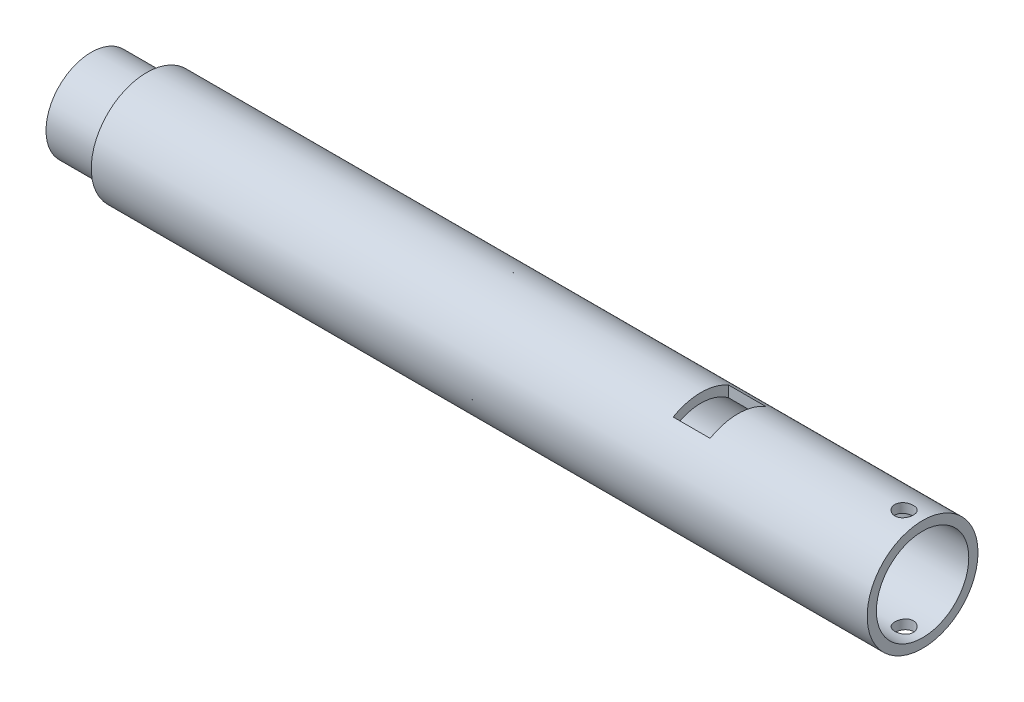
ISO-10303-21;
HEADER;
FILE_DESCRIPTION(('STEP AP214'),'2;1');
FILE_NAME('part.step','',(''),(''),'','','');
FILE_SCHEMA(('AUTOMOTIVE_DESIGN { 1 0 10303 214 1 1 1 1 }'));
ENDSEC;
DATA;
#1=APPLICATION_CONTEXT('core data for automotive mechanical design processes');
#2=APPLICATION_PROTOCOL_DEFINITION('international standard','automotive_design',2000,#1);
#3=PRODUCT_CONTEXT('',#1,'mechanical');
#4=PRODUCT('Part','Part','',(#3));
#5=PRODUCT_RELATED_PRODUCT_CATEGORY('part','',(#4));
#6=PRODUCT_DEFINITION_FORMATION('','',#4);
#7=PRODUCT_DEFINITION_CONTEXT('part definition',#1,'design');
#8=PRODUCT_DEFINITION('design','',#6,#7);
#9=PRODUCT_DEFINITION_SHAPE('','',#8);
#10=(LENGTH_UNIT() NAMED_UNIT(*) SI_UNIT(.MILLI.,.METRE.));
#11=(NAMED_UNIT(*) PLANE_ANGLE_UNIT() SI_UNIT($,.RADIAN.));
#12=(NAMED_UNIT(*) SI_UNIT($,.STERADIAN.) SOLID_ANGLE_UNIT());
#13=UNCERTAINTY_MEASURE_WITH_UNIT(LENGTH_MEASURE(1.E-05),#10,'distance_accuracy_value','');
#14=(GEOMETRIC_REPRESENTATION_CONTEXT(3) GLOBAL_UNCERTAINTY_ASSIGNED_CONTEXT((#13)) GLOBAL_UNIT_ASSIGNED_CONTEXT((#10,
#11,#12)) REPRESENTATION_CONTEXT('',''));
#15=CARTESIAN_POINT('',(0.,0.,0.));
#16=DIRECTION('',(0.,0.,1.));
#17=DIRECTION('',(1.,0.,0.));
#18=AXIS2_PLACEMENT_3D('',#15,#16,#17);
#19=CARTESIAN_POINT('',(0.,0.,0.));
#20=DIRECTION('',(-1.,0.,0.));
#21=DIRECTION('',(0.,0.,1.));
#22=AXIS2_PLACEMENT_3D('',#19,#20,#21);
#23=CYLINDRICAL_SURFACE('',#22,12.25);
#24=CARTESIAN_POINT('',(0.,0.,0.));
#25=DIRECTION('',(-1.,0.,0.));
#26=DIRECTION('',(0.,0.,1.));
#27=AXIS2_PLACEMENT_3D('',#24,#25,#26);
#28=CIRCLE('',#27,12.25);
#29=CARTESIAN_POINT('',(0.,0.,12.25));
#30=VERTEX_POINT('',#29);
#31=EDGE_CURVE('E185',#30,#30,#28,.T.);
#32=ORIENTED_EDGE('',*,*,#31,.T.);
#33=EDGE_LOOP('',(#32));
#34=FACE_BOUND('',#33,.T.);
#35=CARTESIAN_POINT('',(-15.,0.,0.));
#36=DIRECTION('',(-1.,0.,0.));
#37=DIRECTION('',(0.,0.,1.));
#38=AXIS2_PLACEMENT_3D('',#35,#36,#37);
#39=CIRCLE('',#38,12.25);
#40=CARTESIAN_POINT('',(-15.,0.,12.25));
#41=VERTEX_POINT('',#40);
#42=EDGE_CURVE('E12',#41,#41,#39,.T.);
#43=ORIENTED_EDGE('',*,*,#42,.F.);
#44=EDGE_LOOP('',(#43));
#45=FACE_BOUND('',#44,.T.);
#46=ADVANCED_FACE('F51',(#34,#45),#23,.T.);
#47=CARTESIAN_POINT('',(-15.,0.,0.));
#48=DIRECTION('',(-1.,0.,0.));
#49=DIRECTION('',(0.,0.,1.));
#50=AXIS2_PLACEMENT_3D('',#47,#48,#49);
#51=PLANE('',#50);
#52=CARTESIAN_POINT('',(-15.,0.,0.));
#53=DIRECTION('',(-1.,0.,0.));
#54=DIRECTION('',(0.,0.,1.));
#55=AXIS2_PLACEMENT_3D('',#52,#53,#54);
#56=CIRCLE('',#55,10.);
#57=CARTESIAN_POINT('',(-15.,0.,10.));
#58=VERTEX_POINT('',#57);
#59=EDGE_CURVE('E58',#58,#58,#56,.T.);
#60=ORIENTED_EDGE('',*,*,#59,.F.);
#61=EDGE_LOOP('',(#60));
#62=FACE_BOUND('',#61,.T.);
#63=ORIENTED_EDGE('',*,*,#42,.T.);
#64=EDGE_LOOP('',(#63));
#65=FACE_BOUND('',#64,.T.);
#66=ADVANCED_FACE('F229',(#62,#65),#51,.T.);
#67=CARTESIAN_POINT('',(0.,0.,0.));
#68=DIRECTION('',(-1.,0.,0.));
#69=DIRECTION('',(0.,0.,1.));
#70=AXIS2_PLACEMENT_3D('',#67,#68,#69);
#71=CYLINDRICAL_SURFACE('',#70,10.);
#72=ORIENTED_EDGE('',*,*,#59,.T.);
#73=EDGE_LOOP('',(#72));
#74=FACE_BOUND('',#73,.T.);
#75=CARTESIAN_POINT('',(10.,0.,0.));
#76=DIRECTION('',(-1.,0.,0.));
#77=DIRECTION('',(0.,0.,1.));
#78=AXIS2_PLACEMENT_3D('',#75,#76,#77);
#79=CIRCLE('',#78,10.);
#80=CARTESIAN_POINT('',(10.,0.,10.));
#81=VERTEX_POINT('',#80);
#82=EDGE_CURVE('E53',#81,#81,#79,.T.);
#83=ORIENTED_EDGE('',*,*,#82,.F.);
#84=EDGE_LOOP('',(#83));
#85=FACE_BOUND('',#84,.T.);
#86=ADVANCED_FACE('F195',(#74,#85),#71,.F.);
#87=CARTESIAN_POINT('',(0.,0.,0.));
#88=DIRECTION('',(-1.,0.,0.));
#89=DIRECTION('',(0.,0.,1.));
#90=AXIS2_PLACEMENT_3D('',#87,#88,#89);
#91=PLANE('',#90);
#92=ORIENTED_EDGE('',*,*,#31,.F.);
#93=EDGE_LOOP('',(#92));
#94=FACE_BOUND('',#93,.T.);
#95=CARTESIAN_POINT('',(0.,0.,0.));
#96=DIRECTION('',(1.,0.,0.));
#97=DIRECTION('',(0.,0.,-1.));
#98=AXIS2_PLACEMENT_3D('',#95,#96,#97);
#99=CIRCLE('',#98,15.);
#100=CARTESIAN_POINT('',(0.,0.,-15.));
#101=VERTEX_POINT('',#100);
#102=EDGE_CURVE('E200',#101,#101,#99,.T.);
#103=ORIENTED_EDGE('',*,*,#102,.F.);
#104=EDGE_LOOP('',(#103));
#105=FACE_BOUND('',#104,.T.);
#106=ADVANCED_FACE('F192',(#94,#105),#91,.T.);
#107=CARTESIAN_POINT('',(210.,0.,0.));
#108=DIRECTION('',(-1.,0.,0.));
#109=DIRECTION('',(0.,0.,1.));
#110=AXIS2_PLACEMENT_3D('',#107,#108,#109);
#111=CYLINDRICAL_SURFACE('',#110,12.5);
#112=DIRECTION('',(-1.,0.,0.));
#113=VECTOR('',#112,1.);
#114=CARTESIAN_POINT('',(210.,10.,7.5));
#115=LINE('',#114,#113);
#116=CARTESIAN_POINT('',(150.,10.,7.5));
#117=VERTEX_POINT('',#116);
#118=CARTESIAN_POINT('',(160.,10.,7.5));
#119=VERTEX_POINT('',#118);
#120=EDGE_CURVE('E163',#117,#119,#115,.F.);
#121=ORIENTED_EDGE('',*,*,#120,.T.);
#122=CARTESIAN_POINT('',(160.,0.,0.));
#123=DIRECTION('',(-1.,0.,0.));
#124=DIRECTION('',(0.,0.,1.));
#125=AXIS2_PLACEMENT_3D('',#122,#123,#124);
#126=CIRCLE('',#125,12.5);
#127=CARTESIAN_POINT('',(160.,10.,-7.5));
#128=VERTEX_POINT('',#127);
#129=EDGE_CURVE('E104',#119,#128,#126,.T.);
#130=ORIENTED_EDGE('',*,*,#129,.T.);
#131=DIRECTION('',(-1.,0.,0.));
#132=VECTOR('',#131,1.);
#133=CARTESIAN_POINT('',(210.,10.,-7.5));
#134=LINE('',#133,#132);
#135=CARTESIAN_POINT('',(150.,10.,-7.5));
#136=VERTEX_POINT('',#135);
#137=EDGE_CURVE('E175',#128,#136,#134,.T.);
#138=ORIENTED_EDGE('',*,*,#137,.T.);
#139=CARTESIAN_POINT('',(150.,0.,0.));
#140=DIRECTION('',(1.,0.,0.));
#141=DIRECTION('',(0.,0.,-1.));
#142=AXIS2_PLACEMENT_3D('',#139,#140,#141);
#143=CIRCLE('',#142,12.5);
#144=EDGE_CURVE('E170',#136,#117,#143,.T.);
#145=ORIENTED_EDGE('',*,*,#144,.T.);
#146=EDGE_LOOP('',(#121,#130,#138,#145));
#147=FACE_BOUND('',#146,.T.);
#148=CARTESIAN_POINT('',(205.,12.2474487139159,-2.5));
#149=CARTESIAN_POINT('',(204.861089061272,12.2474514756662,-2.49999486468817));
#150=CARTESIAN_POINT('',(204.722113441667,12.2498377067175,-2.48838292929536));
#151=CARTESIAN_POINT('',(204.448093737142,12.2591107826219,-2.4422807089571));
#152=CARTESIAN_POINT('',(204.31305288841,12.2660012286197,-2.40777211767623));
#153=CARTESIAN_POINT('',(204.050906741614,12.2834718430464,-2.31698945654936));
#154=CARTESIAN_POINT('',(203.923793696169,12.2940483405269,-2.26073703538156));
#155=CARTESIAN_POINT('',(203.680812888258,12.3176949870165,-2.12812276917627));
#156=CARTESIAN_POINT('',(203.564944498655,12.3307649968365,-2.05176204650288));
#157=CARTESIAN_POINT('',(203.346097490365,12.3581324923563,-1.87994768913359));
#158=CARTESIAN_POINT('',(203.24330103029,12.3724434459312,-1.7842641397833));
#159=CARTESIAN_POINT('',(203.055106166053,12.400561807565,-1.57701697255328));
#160=CARTESIAN_POINT('',(202.969708981457,12.4143691802708,-1.46545224244496));
#161=CARTESIAN_POINT('',(202.818029955929,12.4400699104391,-1.22840338981063));
#162=CARTESIAN_POINT('',(202.751921215458,12.4519455360388,-1.10280641918052));
#163=CARTESIAN_POINT('',(202.64181265738,12.4722934220908,-0.842010375968175));
#164=CARTESIAN_POINT('',(202.597810770247,12.480766001103,-0.706812203551388));
#165=CARTESIAN_POINT('',(202.533732015951,12.4932580172105,-0.432541933196249));
#166=CARTESIAN_POINT('',(202.513347556072,12.4973346572032,-0.293544348037046));
#167=CARTESIAN_POINT('',(202.496122620404,12.5007730295901,-0.0140464210938512));
#168=CARTESIAN_POINT('',(202.499279875885,12.500135216319,0.126453774579596));
#169=CARTESIAN_POINT('',(202.528815450539,12.4942608717129,0.402855001858956));
#170=CARTESIAN_POINT('',(202.55486244292,12.489089959146,0.538793035746158));
#171=CARTESIAN_POINT('',(202.628912581147,12.4748044289852,0.804329066450734));
#172=CARTESIAN_POINT('',(202.67691660548,12.465689653601,0.933926809367804));
#173=CARTESIAN_POINT('',(202.793825100368,12.444432400499,1.1840486580022));
#174=CARTESIAN_POINT('',(202.862859377762,12.4322712043806,1.30451043533474));
#175=CARTESIAN_POINT('',(203.019772693091,12.4062617368446,1.53226261464938));
#176=CARTESIAN_POINT('',(203.107653899426,12.3924132713806,1.63955149881249));
#177=CARTESIAN_POINT('',(203.301584055271,12.3642741091115,1.83987857763363));
#178=CARTESIAN_POINT('',(203.407922966824,12.3499799114379,1.93263579143407));
#179=CARTESIAN_POINT('',(203.634791106127,12.322789289969,2.09904623294202));
#180=CARTESIAN_POINT('',(203.755320602208,12.3098928926137,2.17269909931937));
#181=CARTESIAN_POINT('',(204.007552079554,12.2869511868231,2.2989070370047));
#182=CARTESIAN_POINT('',(204.139277419099,12.2769120390887,2.35141661944427));
#183=CARTESIAN_POINT('',(204.40992830931,12.2609119080318,2.43347585406895));
#184=CARTESIAN_POINT('',(204.548852919048,12.2549503932107,2.4630284986416));
#185=CARTESIAN_POINT('',(204.827412144998,12.2478869816957,2.49791501509012));
#186=CARTESIAN_POINT('',(204.966993935776,12.2467036764289,2.50365464724478));
#187=CARTESIAN_POINT('',(205.245120557999,12.2491121422213,2.49184407077684));
#188=CARTESIAN_POINT('',(205.383665447797,12.2527036425097,2.4742951828061));
#189=CARTESIAN_POINT('',(205.654421600731,12.2641808123729,2.41675552018539));
#190=CARTESIAN_POINT('',(205.786680857589,12.2720249753624,2.37698155209825));
#191=CARTESIAN_POINT('',(206.042658197572,12.2910872337916,2.27635258827129));
#192=CARTESIAN_POINT('',(206.166375576089,12.3023056071567,2.21549585593293));
#193=CARTESIAN_POINT('',(206.403532774875,12.327035149051,2.07351035553898));
#194=CARTESIAN_POINT('',(206.516817615752,12.3405742966226,1.99212769495687));
#195=CARTESIAN_POINT('',(206.728270780002,12.3683430956659,1.81173893053177));
#196=CARTESIAN_POINT('',(206.826437545623,12.3825728180955,1.71273101286133));
#197=CARTESIAN_POINT('',(207.006406397964,12.4103836467304,1.49808068374472));
#198=CARTESIAN_POINT('',(207.087934136625,12.4239514427171,1.38220624732407));
#199=CARTESIAN_POINT('',(207.230364703749,12.4486781907155,1.13816974158689));
#200=CARTESIAN_POINT('',(207.291268398362,12.4598372438803,1.01000818858377));
#201=CARTESIAN_POINT('',(207.390322179367,12.4784323515267,0.745756702060042));
#202=CARTESIAN_POINT('',(207.428601295566,12.4858894785651,0.609716683695206));
#203=CARTESIAN_POINT('',(207.48172811916,12.4963308984415,0.33297363669979));
#204=CARTESIAN_POINT('',(207.496578648689,12.4993157299962,0.192271171778041));
#205=CARTESIAN_POINT('',(207.502317452407,12.5004635113529,-0.0871822347590421));
#206=CARTESIAN_POINT('',(207.493618201141,12.4987094637332,-0.225924530353726));
#207=CARTESIAN_POINT('',(207.45341512363,12.4907510890085,-0.499927578289116));
#208=CARTESIAN_POINT('',(207.42191158413,12.4845468178608,-0.635188374384297));
#209=CARTESIAN_POINT('',(207.337177519771,12.468387459123,-0.898131874362646));
#210=CARTESIAN_POINT('',(207.283996554673,12.4584409311904,-1.02583110810039));
#211=CARTESIAN_POINT('',(207.157469396672,12.435868053092,-1.27055305046515));
#212=CARTESIAN_POINT('',(207.084121610239,12.4232414911747,-1.3875749144196));
#213=CARTESIAN_POINT('',(206.917951532347,12.3964399789185,-1.60965972526477));
#214=CARTESIAN_POINT('',(206.824834159041,12.3822433354475,-1.71449929028708));
#215=CARTESIAN_POINT('',(206.622374399753,12.3540305726966,-1.90720654439625));
#216=CARTESIAN_POINT('',(206.5130281763,12.340014496968,-1.99507020802227));
#217=CARTESIAN_POINT('',(206.279801708274,12.3135835683483,-2.15223054862494));
#218=CARTESIAN_POINT('',(206.155777597197,12.3011875892806,-2.22131703654521));
#219=CARTESIAN_POINT('',(205.89766806685,12.2796309281603,-2.33756012316556));
#220=CARTESIAN_POINT('',(205.763591903282,12.2704673131246,-2.3847366149354));
#221=CARTESIAN_POINT('',(205.524343861393,12.2582420284461,-2.44667284964413));
#222=CARTESIAN_POINT('',(205.420536451215,12.2542196228652,-2.4666347463092));
#223=CARTESIAN_POINT('',(205.211165113622,12.2488219614771,-2.49330004489927));
#224=CARTESIAN_POINT('',(205.105601246889,12.2474466144105,-2.5000039039066));
#225=CARTESIAN_POINT('',(205.,12.2474487139159,-2.5));
#226=B_SPLINE_CURVE_WITH_KNOTS('',3,(#148,#149,#150,#151,#152,#153,#154,#155,#156,#157,#158,
#159,#160,#161,#162,#163,#164,#165,#166,#167,#168,#169,#170,#171,#172,#173,#174,#175,#176,#177,
#178,#179,#180,#181,#182,#183,#184,#185,#186,#187,#188,#189,#190,#191,#192,#193,#194,#195,#196,
#197,#198,#199,#200,#201,#202,#203,#204,#205,#206,#207,#208,#209,#210,#211,#212,#213,#214,#215,
#216,#217,#218,#219,#220,#221,#222,#223,#224,#225),.UNSPECIFIED.,.T.,.F.,(4,2,2,2,2,2,2,2,2,2,2,
2,2,2,2,2,2,2,2,2,2,2,2,2,2,2,2,2,2,2,2,2,2,2,2,2,2,2,4),(0.,0.416346159673539,
0.833025598210731,1.24929124485145,1.66553366214964,2.08705631371092,2.50860850088555,
2.93383501093626,3.35902170616398,3.77860622207699,4.19815030290619,4.61171974083841,
5.02530572684374,5.44149810555756,5.85773839425164,6.28123366906206,6.70473695306801,
7.12914657931941,7.55350087540059,7.97059394511484,8.38766336321051,8.80073354458296,
9.21383775885995,9.63232649436305,10.0508583217552,10.4758150433362,10.9007539157526,
11.3232453394662,11.7456858672907,12.1607754353671,12.5758597841689,12.9900004268863,
13.4041738033671,13.8250288006399,14.2459834722445,14.6714724644901,15.0965743772549,
15.413095090954,15.729604892137),.UNSPECIFIED.);
#227=CARTESIAN_POINT('',(205.,12.2474487139159,-2.5));
#228=VERTEX_POINT('',#227);
#229=EDGE_CURVE('E118',#228,#228,#226,.T.);
#230=ORIENTED_EDGE('',*,*,#229,.T.);
#231=EDGE_LOOP('',(#230));
#232=FACE_BOUND('',#231,.T.);
#233=CARTESIAN_POINT('',(210.,0.,0.));
#234=DIRECTION('',(1.,0.,0.));
#235=DIRECTION('',(0.,0.,-1.));
#236=AXIS2_PLACEMENT_3D('',#233,#234,#235);
#237=CIRCLE('',#236,12.5);
#238=CARTESIAN_POINT('',(210.,0.,-12.5));
#239=VERTEX_POINT('',#238);
#240=EDGE_CURVE('E205',#239,#239,#237,.T.);
#241=ORIENTED_EDGE('',*,*,#240,.T.);
#242=EDGE_LOOP('',(#241));
#243=FACE_BOUND('',#242,.T.);
#244=CARTESIAN_POINT('',(205.,-12.2474487139159,-2.5));
#245=CARTESIAN_POINT('',(205.138910938728,-12.2474514756662,-2.49999486468817));
#246=CARTESIAN_POINT('',(205.277886558333,-12.2498377067175,-2.48838292929536));
#247=CARTESIAN_POINT('',(205.551906262858,-12.2591107826219,-2.4422807089571));
#248=CARTESIAN_POINT('',(205.68694711159,-12.2660012286197,-2.40777211767623));
#249=CARTESIAN_POINT('',(205.949093258385,-12.2834718430464,-2.31698945654936));
#250=CARTESIAN_POINT('',(206.076206303831,-12.2940483405269,-2.26073703538156));
#251=CARTESIAN_POINT('',(206.319187111742,-12.3176949870165,-2.12812276917627));
#252=CARTESIAN_POINT('',(206.435055501345,-12.3307649968365,-2.05176204650288));
#253=CARTESIAN_POINT('',(206.653902509635,-12.3581324923563,-1.87994768913359));
#254=CARTESIAN_POINT('',(206.75669896971,-12.3724434459312,-1.7842641397833));
#255=CARTESIAN_POINT('',(206.944893833947,-12.400561807565,-1.57701697255328));
#256=CARTESIAN_POINT('',(207.030291018543,-12.4143691802708,-1.46545224244496));
#257=CARTESIAN_POINT('',(207.181970044071,-12.440069910439,-1.22840338981064));
#258=CARTESIAN_POINT('',(207.248078784542,-12.4519455360388,-1.10280641918053));
#259=CARTESIAN_POINT('',(207.35818734262,-12.4722934220908,-0.84201037596819));
#260=CARTESIAN_POINT('',(207.402189229752,-12.480766001103,-0.706812203551395));
#261=CARTESIAN_POINT('',(207.466267984049,-12.4932580172105,-0.43254193319625));
#262=CARTESIAN_POINT('',(207.486652443927,-12.4973346572032,-0.29354434803705));
#263=CARTESIAN_POINT('',(207.503877379596,-12.5007730295901,-0.0140464210938544));
#264=CARTESIAN_POINT('',(207.500720124115,-12.500135216319,0.126453774579596));
#265=CARTESIAN_POINT('',(207.471184549461,-12.4942608717129,0.402855001858959));
#266=CARTESIAN_POINT('',(207.44513755708,-12.489089959146,0.538793035746161));
#267=CARTESIAN_POINT('',(207.371087418853,-12.4748044289852,0.804329066450737));
#268=CARTESIAN_POINT('',(207.32308339452,-12.465689653601,0.933926809367807));
#269=CARTESIAN_POINT('',(207.206174899632,-12.444432400499,1.18404865800221));
#270=CARTESIAN_POINT('',(207.137140622238,-12.4322712043806,1.30451043533474));
#271=CARTESIAN_POINT('',(206.980227306908,-12.4062617368446,1.53226261464938));
#272=CARTESIAN_POINT('',(206.892346100574,-12.3924132713806,1.63955149881249));
#273=CARTESIAN_POINT('',(206.698415944729,-12.3642741091115,1.83987857763363));
#274=CARTESIAN_POINT('',(206.592077033176,-12.3499799114379,1.93263579143407));
#275=CARTESIAN_POINT('',(206.365208893873,-12.322789289969,2.09904623294202));
#276=CARTESIAN_POINT('',(206.244679397792,-12.3098928926137,2.17269909931937));
#277=CARTESIAN_POINT('',(205.992447920445,-12.2869511868231,2.2989070370047));
#278=CARTESIAN_POINT('',(205.860722580901,-12.2769120390887,2.35141661944427));
#279=CARTESIAN_POINT('',(205.59007169069,-12.2609119080318,2.43347585406895));
#280=CARTESIAN_POINT('',(205.451147080952,-12.2549503932107,2.4630284986416));
#281=CARTESIAN_POINT('',(205.172587855002,-12.2478869816957,2.49791501509012));
#282=CARTESIAN_POINT('',(205.033006064224,-12.2467036764289,2.50365464724478));
#283=CARTESIAN_POINT('',(204.754879442001,-12.2491121422213,2.49184407077684));
#284=CARTESIAN_POINT('',(204.616334552203,-12.2527036425097,2.4742951828061));
#285=CARTESIAN_POINT('',(204.345578399269,-12.2641808123729,2.41675552018539));
#286=CARTESIAN_POINT('',(204.213319142411,-12.2720249753624,2.37698155209825));
#287=CARTESIAN_POINT('',(203.957341802428,-12.2910872337916,2.27635258827129));
#288=CARTESIAN_POINT('',(203.833624423911,-12.3023056071567,2.21549585593294));
#289=CARTESIAN_POINT('',(203.596467225125,-12.327035149051,2.07351035553899));
#290=CARTESIAN_POINT('',(203.483182384248,-12.3405742966226,1.99212769495689));
#291=CARTESIAN_POINT('',(203.271729219998,-12.3683430956659,1.81173893053179));
#292=CARTESIAN_POINT('',(203.173562454377,-12.3825728180955,1.71273101286135));
#293=CARTESIAN_POINT('',(202.993593602036,-12.4103836467304,1.49808068374472));
#294=CARTESIAN_POINT('',(202.912065863375,-12.4239514427171,1.38220624732407));
#295=CARTESIAN_POINT('',(202.769635296251,-12.4486781907155,1.13816974158689));
#296=CARTESIAN_POINT('',(202.708731601638,-12.4598372438803,1.01000818858377));
#297=CARTESIAN_POINT('',(202.609677820633,-12.4784323515267,0.745756702060042));
#298=CARTESIAN_POINT('',(202.571398704434,-12.4858894785651,0.609716683695206));
#299=CARTESIAN_POINT('',(202.51827188084,-12.4963308984415,0.33297363669979));
#300=CARTESIAN_POINT('',(202.503421351311,-12.4993157299962,0.192271171778041));
#301=CARTESIAN_POINT('',(202.497682547593,-12.5004635113529,-0.0871822347590422));
#302=CARTESIAN_POINT('',(202.506381798859,-12.4987094637332,-0.225924530353726));
#303=CARTESIAN_POINT('',(202.54658487637,-12.4907510890085,-0.499927578289116));
#304=CARTESIAN_POINT('',(202.57808841587,-12.4845468178608,-0.635188374384295));
#305=CARTESIAN_POINT('',(202.662822480229,-12.468387459123,-0.898131874362654));
#306=CARTESIAN_POINT('',(202.716003445327,-12.4584409311904,-1.02583110810041));
#307=CARTESIAN_POINT('',(202.842530603328,-12.435868053092,-1.27055305046517));
#308=CARTESIAN_POINT('',(202.915878389761,-12.4232414911747,-1.3875749144196));
#309=CARTESIAN_POINT('',(203.082048467653,-12.3964399789185,-1.60965972526478));
#310=CARTESIAN_POINT('',(203.175165840959,-12.3822433354475,-1.7144992902871));
#311=CARTESIAN_POINT('',(203.377625600247,-12.3540305726966,-1.90720654439626));
#312=CARTESIAN_POINT('',(203.4869718237,-12.340014496968,-1.99507020802228));
#313=CARTESIAN_POINT('',(203.720198291726,-12.3135835683483,-2.15223054862494));
#314=CARTESIAN_POINT('',(203.844222402803,-12.3011875892806,-2.22131703654521));
#315=CARTESIAN_POINT('',(204.10233193315,-12.2796309281603,-2.33756012316556));
#316=CARTESIAN_POINT('',(204.236408096718,-12.2704673131246,-2.3847366149354));
#317=CARTESIAN_POINT('',(204.475656138607,-12.2582420284461,-2.44667284964413));
#318=CARTESIAN_POINT('',(204.579463548785,-12.2542196228652,-2.4666347463092));
#319=CARTESIAN_POINT('',(204.788834886378,-12.2488219614771,-2.49330004489927));
#320=CARTESIAN_POINT('',(204.894398753111,-12.2474466144105,-2.5000039039066));
#321=CARTESIAN_POINT('',(205.,-12.2474487139159,-2.5));
#322=B_SPLINE_CURVE_WITH_KNOTS('',3,(#244,#245,#246,#247,#248,#249,#250,#251,#252,#253,#254,
#255,#256,#257,#258,#259,#260,#261,#262,#263,#264,#265,#266,#267,#268,#269,#270,#271,#272,#273,
#274,#275,#276,#277,#278,#279,#280,#281,#282,#283,#284,#285,#286,#287,#288,#289,#290,#291,#292,
#293,#294,#295,#296,#297,#298,#299,#300,#301,#302,#303,#304,#305,#306,#307,#308,#309,#310,#311,
#312,#313,#314,#315,#316,#317,#318,#319,#320,#321),.UNSPECIFIED.,.T.,.F.,(4,2,2,2,2,2,2,2,2,2,2,
2,2,2,2,2,2,2,2,2,2,2,2,2,2,2,2,2,2,2,2,2,2,2,2,2,2,2,4),(0.,0.416346159673539,
0.833025598210731,1.24929124485145,1.66553366214964,2.08705631371092,2.50860850088555,
2.93383501093624,3.35902170616398,3.77860622207699,4.19815030290619,4.61171974083842,
5.02530572684374,5.44149810555756,5.85773839425164,6.28123366906206,6.70473695306801,
7.1291465793194,7.55350087540059,7.97059394511483,8.38766336321051,8.80073354458296,
9.21383775885995,9.63232649436298,10.0508583217552,10.4758150433362,10.9007539157526,
11.3232453394662,11.7456858672907,12.1607754353671,12.5758597841689,12.9900004268863,
13.4041738033671,13.8250288006399,14.2459834722445,14.6714724644901,15.0965743772549,
15.413095090954,15.729604892137),.UNSPECIFIED.);
#323=CARTESIAN_POINT('',(205.,-12.2474487139159,-2.5));
#324=VERTEX_POINT('',#323);
#325=EDGE_CURVE('E114',#324,#324,#322,.T.);
#326=ORIENTED_EDGE('',*,*,#325,.T.);
#327=EDGE_LOOP('',(#326));
#328=FACE_BOUND('',#327,.T.);
#329=CARTESIAN_POINT('',(10.,0.,0.));
#330=DIRECTION('',(-1.,0.,0.));
#331=DIRECTION('',(0.,0.,1.));
#332=AXIS2_PLACEMENT_3D('',#329,#330,#331);
#333=CIRCLE('',#332,12.5);
#334=CARTESIAN_POINT('',(10.,0.,12.5));
#335=VERTEX_POINT('',#334);
#336=EDGE_CURVE('E179',#335,#335,#333,.T.);
#337=ORIENTED_EDGE('',*,*,#336,.T.);
#338=EDGE_LOOP('',(#337));
#339=FACE_BOUND('',#338,.T.);
#340=ADVANCED_FACE('F146',(#147,#232,#243,#328,#339),#111,.F.);
#341=CARTESIAN_POINT('',(210.,0.,0.));
#342=DIRECTION('',(-1.,0.,0.));
#343=DIRECTION('',(0.,0.,1.));
#344=AXIS2_PLACEMENT_3D('',#341,#342,#343);
#345=CYLINDRICAL_SURFACE('',#344,15.);
#346=CARTESIAN_POINT('',(205.,14.790199457749,-2.5));
#347=CARTESIAN_POINT('',(204.860624251838,14.790201973666,-2.49999439841982));
#348=CARTESIAN_POINT('',(204.721172393928,14.7921909238523,-2.48830516902828));
#349=CARTESIAN_POINT('',(204.446181456737,14.7999245720004,-2.44187742806637));
#350=CARTESIAN_POINT('',(204.310646106242,14.8056727334637,-2.4071176603086));
#351=CARTESIAN_POINT('',(204.047507716658,14.8202560936731,-2.31562954367049));
#352=CARTESIAN_POINT('',(203.919898151338,14.8290887118401,-2.25891955493198));
#353=CARTESIAN_POINT('',(203.676019045282,14.8488427210228,-2.12518649688945));
#354=CARTESIAN_POINT('',(203.559748230423,14.8597638769423,-2.04816571350131));
#355=CARTESIAN_POINT('',(203.340687150255,14.8825847115588,-1.87518752696652));
#356=CARTESIAN_POINT('',(203.238024868614,14.8944921732795,-1.77906904893231));
#357=CARTESIAN_POINT('',(203.050206693138,14.9178748066858,-1.57097200469525));
#358=CARTESIAN_POINT('',(202.965051836885,14.9293499527174,-1.45899249914995));
#359=CARTESIAN_POINT('',(202.814185432781,14.9506573698271,-1.22152286994834));
#360=CARTESIAN_POINT('',(202.748592992268,14.9604794243234,-1.09595608145669));
#361=CARTESIAN_POINT('',(202.639478929469,14.9772873695709,-0.835395621723853));
#362=CARTESIAN_POINT('',(202.595955872115,14.9842734447266,-0.700402564078179));
#363=CARTESIAN_POINT('',(202.532607465016,14.994567347244,-0.426143726344243));
#364=CARTESIAN_POINT('',(202.512567083995,14.9979085311091,-0.286928886679275));
#365=CARTESIAN_POINT('',(202.496084245847,15.0006507934278,-0.00707528552580701));
#366=CARTESIAN_POINT('',(202.499640184753,15.0000521396931,0.133563378528887));
#367=CARTESIAN_POINT('',(202.530081351528,14.9950085843139,0.410802185078864));
#368=CARTESIAN_POINT('',(202.556735163409,14.990601836924,0.547428530700132));
#369=CARTESIAN_POINT('',(202.632251074246,14.9784797877164,0.814241979611783));
#370=CARTESIAN_POINT('',(202.681113849589,14.9707643851321,0.944428886651495));
#371=CARTESIAN_POINT('',(202.799890640315,14.9528269851196,1.19535614778264));
#372=CARTESIAN_POINT('',(202.869900012082,14.9425936732688,1.31605052301903));
#373=CARTESIAN_POINT('',(203.028912822635,14.920757380715,1.54406552984663));
#374=CARTESIAN_POINT('',(203.117917798711,14.9091542891913,1.65138507791586));
#375=CARTESIAN_POINT('',(203.313678806619,14.885702682326,1.85097127344665));
#376=CARTESIAN_POINT('',(203.420637094901,14.8738528973104,1.9430395022532));
#377=CARTESIAN_POINT('',(203.648587090216,14.8513795978481,2.10795458844806));
#378=CARTESIAN_POINT('',(203.769578926683,14.8407560947132,2.18080126853241));
#379=CARTESIAN_POINT('',(204.022391641877,14.8219375456182,2.30524443448828));
#380=CARTESIAN_POINT('',(204.154224498092,14.813745233026,2.35681702727923));
#381=CARTESIAN_POINT('',(204.424849072307,14.8007618868988,2.4370298708156));
#382=CARTESIAN_POINT('',(204.563640176432,14.7959705538832,2.46567214076794));
#383=CARTESIAN_POINT('',(204.842466156162,14.7903895942212,2.49893188487926));
#384=CARTESIAN_POINT('',(204.982466379702,14.7895528575867,2.50383220791243));
#385=CARTESIAN_POINT('',(205.261286671691,14.7918503478236,2.49022270268246));
#386=CARTESIAN_POINT('',(205.400106785514,14.7949844213185,2.47171377862466));
#387=CARTESIAN_POINT('',(205.671727759191,14.8048268745502,2.4120523349281));
#388=CARTESIAN_POINT('',(205.804561139878,14.8115125191835,2.37104379064639));
#389=CARTESIAN_POINT('',(206.061470166279,14.827685730055,2.26769819019229));
#390=CARTESIAN_POINT('',(206.185545287551,14.8371734639058,2.20535985810095));
#391=CARTESIAN_POINT('',(206.422674594406,14.8579912839739,2.06045667322924));
#392=CARTESIAN_POINT('',(206.535616572756,14.8693375560035,1.97771056415937));
#393=CARTESIAN_POINT('',(206.746113532695,14.8925466667987,1.79458946570798));
#394=CARTESIAN_POINT('',(206.84366743111,14.9044095418533,1.69421323638405));
#395=CARTESIAN_POINT('',(207.021651892729,14.9274642211826,1.47742807032882));
#396=CARTESIAN_POINT('',(207.101893826284,14.9386477634467,1.36086325338621));
#397=CARTESIAN_POINT('',(207.241655327005,14.9589511243294,1.11574344794934));
#398=CARTESIAN_POINT('',(207.301175564474,14.9680710096998,0.98718884747064));
#399=CARTESIAN_POINT('',(207.397510583955,14.9831835816958,0.722299051501342));
#400=CARTESIAN_POINT('',(207.434424075735,14.9891898456762,0.586000562602626));
#401=CARTESIAN_POINT('',(207.484815598964,14.9974558316928,0.309030734874224));
#402=CARTESIAN_POINT('',(207.498295558732,14.9997158620019,0.168359756821631));
#403=CARTESIAN_POINT('',(207.501381882312,15.0002303788781,-0.111541275773667));
#404=CARTESIAN_POINT('',(207.491275253941,14.9985330202419,-0.250768160602654));
#405=CARTESIAN_POINT('',(207.448096077731,14.9914217838733,-0.525511974314694));
#406=CARTESIAN_POINT('',(207.41502365849,14.9860079269518,-0.66102892396747));
#407=CARTESIAN_POINT('',(207.326961834456,14.972069888274,-0.924396445918526));
#408=CARTESIAN_POINT('',(207.27199683179,14.9635491704088,-1.0522553721538));
#409=CARTESIAN_POINT('',(207.141742063769,14.9443275687803,-1.29698045298215));
#410=CARTESIAN_POINT('',(207.066451334938,14.9336265816741,-1.41384608611821));
#411=CARTESIAN_POINT('',(206.896664907539,14.9110762961641,-1.63471294552638));
#412=CARTESIAN_POINT('',(206.801959045249,14.8992152454112,-1.73855143060272));
#413=CARTESIAN_POINT('',(206.596471692096,14.8757630331437,-1.92896387595088));
#414=CARTESIAN_POINT('',(206.485686441087,14.8641719354951,-2.01553378671188));
#415=CARTESIAN_POINT('',(206.25025467751,14.8424834353391,-2.16951427091085));
#416=CARTESIAN_POINT('',(206.125515660234,14.8323971784578,-2.23678498905769));
#417=CARTESIAN_POINT('',(205.866390764162,14.8149921009131,-2.34931453640427));
#418=CARTESIAN_POINT('',(205.732014677323,14.8076705172488,-2.39459535522307));
#419=CARTESIAN_POINT('',(205.497596230513,14.7982474485649,-2.45202605312742));
#420=CARTESIAN_POINT('',(205.398973192037,14.7952462341947,-2.46998741767138));
#421=CARTESIAN_POINT('',(205.200246515163,14.7912213528807,-2.49397629518131));
#422=CARTESIAN_POINT('',(205.100142903676,14.7901976500369,-2.50000402479277));
#423=CARTESIAN_POINT('',(205.,14.790199457749,-2.5));
#424=B_SPLINE_CURVE_WITH_KNOTS('',3,(#346,#347,#348,#349,#350,#351,#352,#353,#354,#355,#356,
#357,#358,#359,#360,#361,#362,#363,#364,#365,#366,#367,#368,#369,#370,#371,#372,#373,#374,#375,
#376,#377,#378,#379,#380,#381,#382,#383,#384,#385,#386,#387,#388,#389,#390,#391,#392,#393,#394,
#395,#396,#397,#398,#399,#400,#401,#402,#403,#404,#405,#406,#407,#408,#409,#410,#411,#412,#413,
#414,#415,#416,#417,#418,#419,#420,#421,#422,#423),.UNSPECIFIED.,.T.,.F.,(4,2,2,2,2,2,2,2,2,2,2,
2,2,2,2,2,2,2,2,2,2,2,2,2,2,2,2,2,2,2,2,2,2,2,2,2,2,2,4),(0.,0.417761038927736,
0.835907519962962,1.25370499787522,1.67145547405275,2.09289159155718,2.51435267834448,
2.93832980111437,3.36227935111112,3.78231567472564,4.2023234465269,4.61817121164667,
5.03403164249531,5.45179604139423,5.86959426226762,6.29246123462123,6.71533210746016,
7.138676624986,7.56198385938072,7.98023542420403,8.39847083413972,8.81406064635487,
9.2296753229357,9.64912342762699,10.0686010443069,10.4924411303538,10.9162675047669,
11.3382298441764,11.7601574591235,12.1769777626591,12.5937957321882,13.0101503983245,
13.4265248039233,13.8476699746325,14.2689137888181,14.6931372761832,15.1169356674445,
15.4171067054376,15.7172722940182),.UNSPECIFIED.);
#425=CARTESIAN_POINT('',(205.,14.790199457749,-2.5));
#426=VERTEX_POINT('',#425);
#427=EDGE_CURVE('E135',#426,#426,#424,.T.);
#428=ORIENTED_EDGE('',*,*,#427,.F.);
#429=EDGE_LOOP('',(#428));
#430=FACE_BOUND('',#429,.T.);
#431=CARTESIAN_POINT('',(205.,-14.790199457749,-2.5));
#432=CARTESIAN_POINT('',(205.139375748162,-14.790201973666,-2.49999439841982));
#433=CARTESIAN_POINT('',(205.278827606071,-14.7921909238523,-2.48830516902828));
#434=CARTESIAN_POINT('',(205.553818543263,-14.7999245720004,-2.44187742806638));
#435=CARTESIAN_POINT('',(205.689353893758,-14.8056727334637,-2.40711766030861));
#436=CARTESIAN_POINT('',(205.952492283342,-14.8202560936731,-2.31562954367049));
#437=CARTESIAN_POINT('',(206.080101848662,-14.8290887118401,-2.25891955493198));
#438=CARTESIAN_POINT('',(206.323980954718,-14.8488427210228,-2.12518649688945));
#439=CARTESIAN_POINT('',(206.440251769577,-14.8597638769423,-2.04816571350131));
#440=CARTESIAN_POINT('',(206.659312849745,-14.8825847115588,-1.87518752696653));
#441=CARTESIAN_POINT('',(206.761975131386,-14.8944921732795,-1.77906904893232));
#442=CARTESIAN_POINT('',(206.949793306862,-14.9178748066858,-1.57097200469526));
#443=CARTESIAN_POINT('',(207.034948163115,-14.9293499527174,-1.45899249914996));
#444=CARTESIAN_POINT('',(207.185814567219,-14.9506573698271,-1.22152286994835));
#445=CARTESIAN_POINT('',(207.251407007732,-14.9604794243234,-1.0959560814567));
#446=CARTESIAN_POINT('',(207.360521070531,-14.9772873695709,-0.835395621723868));
#447=CARTESIAN_POINT('',(207.404044127885,-14.9842734447266,-0.700402564078186));
#448=CARTESIAN_POINT('',(207.467392534984,-14.994567347244,-0.426143726344242));
#449=CARTESIAN_POINT('',(207.487432916005,-14.9979085311091,-0.286928886679275));
#450=CARTESIAN_POINT('',(207.503915754153,-15.0006507934278,-0.00707528552580723));
#451=CARTESIAN_POINT('',(207.500359815247,-15.0000521396931,0.133563378528886));
#452=CARTESIAN_POINT('',(207.469918648472,-14.9950085843139,0.410802185078864));
#453=CARTESIAN_POINT('',(207.443264836591,-14.990601836924,0.547428530700132));
#454=CARTESIAN_POINT('',(207.367748925753,-14.9784797877164,0.814241979611783));
#455=CARTESIAN_POINT('',(207.31888615041,-14.9707643851321,0.944428886651495));
#456=CARTESIAN_POINT('',(207.200109359685,-14.9528269851196,1.19535614778264));
#457=CARTESIAN_POINT('',(207.130099987918,-14.9425936732688,1.31605052301903));
#458=CARTESIAN_POINT('',(206.971087177365,-14.920757380715,1.54406552984663));
#459=CARTESIAN_POINT('',(206.882082201289,-14.9091542891913,1.65138507791586));
#460=CARTESIAN_POINT('',(206.686321193381,-14.885702682326,1.85097127344665));
#461=CARTESIAN_POINT('',(206.579362905099,-14.8738528973104,1.9430395022532));
#462=CARTESIAN_POINT('',(206.351412909784,-14.8513795978481,2.10795458844806));
#463=CARTESIAN_POINT('',(206.230421073317,-14.8407560947132,2.18080126853241));
#464=CARTESIAN_POINT('',(205.977608358123,-14.8219375456182,2.30524443448828));
#465=CARTESIAN_POINT('',(205.845775501908,-14.813745233026,2.35681702727923));
#466=CARTESIAN_POINT('',(205.575150927692,-14.8007618868988,2.4370298708156));
#467=CARTESIAN_POINT('',(205.436359823568,-14.7959705538832,2.46567214076794));
#468=CARTESIAN_POINT('',(205.157533843838,-14.7903895942212,2.49893188487926));
#469=CARTESIAN_POINT('',(205.017533620298,-14.7895528575867,2.50383220791243));
#470=CARTESIAN_POINT('',(204.738713328309,-14.7918503478236,2.49022270268246));
#471=CARTESIAN_POINT('',(204.599893214486,-14.7949844213185,2.47171377862467));
#472=CARTESIAN_POINT('',(204.328272240809,-14.8048268745502,2.4120523349281));
#473=CARTESIAN_POINT('',(204.195438860122,-14.8115125191835,2.37104379064639));
#474=CARTESIAN_POINT('',(203.938529833721,-14.827685730055,2.26769819019228));
#475=CARTESIAN_POINT('',(203.814454712449,-14.8371734639058,2.20535985810095));
#476=CARTESIAN_POINT('',(203.577325405594,-14.8579912839739,2.06045667322924));
#477=CARTESIAN_POINT('',(203.464383427244,-14.8693375560035,1.97771056415937));
#478=CARTESIAN_POINT('',(203.253886467305,-14.8925466667987,1.79458946570798));
#479=CARTESIAN_POINT('',(203.15633256889,-14.9044095418533,1.69421323638405));
#480=CARTESIAN_POINT('',(202.978348107271,-14.9274642211826,1.47742807032882));
#481=CARTESIAN_POINT('',(202.898106173715,-14.9386477634467,1.36086325338621));
#482=CARTESIAN_POINT('',(202.758344672995,-14.9589511243294,1.11574344794934));
#483=CARTESIAN_POINT('',(202.698824435526,-14.9680710096998,0.98718884747064));
#484=CARTESIAN_POINT('',(202.602489416045,-14.9831835816958,0.722299051501345));
#485=CARTESIAN_POINT('',(202.565575924265,-14.9891898456762,0.586000562602632));
#486=CARTESIAN_POINT('',(202.515184401036,-14.9974558316928,0.30903073487423));
#487=CARTESIAN_POINT('',(202.501704441268,-14.9997158620019,0.168359756821634));
#488=CARTESIAN_POINT('',(202.498618117688,-15.0002303788781,-0.111541275773667));
#489=CARTESIAN_POINT('',(202.508724746059,-14.9985330202419,-0.250768160602654));
#490=CARTESIAN_POINT('',(202.551903922269,-14.9914217838733,-0.525511974314694));
#491=CARTESIAN_POINT('',(202.58497634151,-14.9860079269518,-0.661028923967469));
#492=CARTESIAN_POINT('',(202.673038165544,-14.972069888274,-0.924396445918534));
#493=CARTESIAN_POINT('',(202.72800316821,-14.9635491704088,-1.05225537215382));
#494=CARTESIAN_POINT('',(202.858257936231,-14.9443275687803,-1.29698045298217));
#495=CARTESIAN_POINT('',(202.933548665062,-14.9336265816741,-1.41384608611822));
#496=CARTESIAN_POINT('',(203.10333509246,-14.9110762961641,-1.63471294552639));
#497=CARTESIAN_POINT('',(203.198040954751,-14.8992152454112,-1.73855143060275));
#498=CARTESIAN_POINT('',(203.403528307904,-14.8757630331437,-1.92896387595091));
#499=CARTESIAN_POINT('',(203.514313558913,-14.8641719354951,-2.01553378671189));
#500=CARTESIAN_POINT('',(203.74974532249,-14.8424834353391,-2.16951427091085));
#501=CARTESIAN_POINT('',(203.874484339765,-14.8323971784578,-2.23678498905769));
#502=CARTESIAN_POINT('',(204.133609235838,-14.8149921009131,-2.34931453640427));
#503=CARTESIAN_POINT('',(204.267985322677,-14.8076705172488,-2.39459535522307));
#504=CARTESIAN_POINT('',(204.502403769487,-14.7982474485649,-2.45202605312742));
#505=CARTESIAN_POINT('',(204.601026807963,-14.7952462341947,-2.46998741767138));
#506=CARTESIAN_POINT('',(204.799753484837,-14.7912213528807,-2.49397629518131));
#507=CARTESIAN_POINT('',(204.899857096324,-14.7901976500369,-2.50000402479277));
#508=CARTESIAN_POINT('',(205.,-14.790199457749,-2.5));
#509=B_SPLINE_CURVE_WITH_KNOTS('',3,(#431,#432,#433,#434,#435,#436,#437,#438,#439,#440,#441,
#442,#443,#444,#445,#446,#447,#448,#449,#450,#451,#452,#453,#454,#455,#456,#457,#458,#459,#460,
#461,#462,#463,#464,#465,#466,#467,#468,#469,#470,#471,#472,#473,#474,#475,#476,#477,#478,#479,
#480,#481,#482,#483,#484,#485,#486,#487,#488,#489,#490,#491,#492,#493,#494,#495,#496,#497,#498,
#499,#500,#501,#502,#503,#504,#505,#506,#507,#508),.UNSPECIFIED.,.T.,.F.,(4,2,2,2,2,2,2,2,2,2,2,
2,2,2,2,2,2,2,2,2,2,2,2,2,2,2,2,2,2,2,2,2,2,2,2,2,2,2,4),(0.,0.417761038927708,
0.835907519962962,1.25370499787522,1.67145547405275,2.09289159155717,2.51435267834448,
2.93832980111435,3.36227935111113,3.78231567472564,4.2023234465269,4.61817121164667,
5.03403164249531,5.45179604139423,5.86959426226763,6.29246123462123,6.71533210746017,
7.138676624986,7.56198385938072,7.98023542420404,8.39847083413972,8.81406064635487,
9.2296753229357,9.649123427627,10.0686010443069,10.4924411303538,10.9162675047669,
11.3382298441764,11.7601574591235,12.1769777626591,12.5937957321882,13.0101503983246,
13.4265248039233,13.8476699746325,14.2689137888181,14.6931372761832,15.1169356674445,
15.4171067054376,15.7172722940182),.UNSPECIFIED.);
#510=CARTESIAN_POINT('',(205.,-14.790199457749,-2.5));
#511=VERTEX_POINT('',#510);
#512=EDGE_CURVE('E124',#511,#511,#509,.T.);
#513=ORIENTED_EDGE('',*,*,#512,.F.);
#514=EDGE_LOOP('',(#513));
#515=FACE_BOUND('',#514,.T.);
#516=ORIENTED_EDGE('',*,*,#102,.T.);
#517=EDGE_LOOP('',(#516));
#518=FACE_BOUND('',#517,.T.);
#519=CARTESIAN_POINT('',(210.,0.,0.));
#520=DIRECTION('',(1.,0.,0.));
#521=DIRECTION('',(0.,0.,-1.));
#522=AXIS2_PLACEMENT_3D('',#519,#520,#521);
#523=CIRCLE('',#522,15.);
#524=CARTESIAN_POINT('',(210.,0.,-15.));
#525=VERTEX_POINT('',#524);
#526=EDGE_CURVE('E169',#525,#525,#523,.T.);
#527=ORIENTED_EDGE('',*,*,#526,.F.);
#528=EDGE_LOOP('',(#527));
#529=FACE_BOUND('',#528,.T.);
#530=CARTESIAN_POINT('',(160.,0.,0.));
#531=DIRECTION('',(-1.,0.,0.));
#532=DIRECTION('',(0.,0.,1.));
#533=AXIS2_PLACEMENT_3D('',#530,#531,#532);
#534=CIRCLE('',#533,15.);
#535=CARTESIAN_POINT('',(160.,12.9903810567666,7.5));
#536=VERTEX_POINT('',#535);
#537=CARTESIAN_POINT('',(160.,12.9903810567666,-7.5));
#538=VERTEX_POINT('',#537);
#539=EDGE_CURVE('E105',#536,#538,#534,.T.);
#540=ORIENTED_EDGE('',*,*,#539,.F.);
#541=DIRECTION('',(-1.,0.,0.));
#542=VECTOR('',#541,1.);
#543=CARTESIAN_POINT('',(210.,12.9903810567666,7.5));
#544=LINE('',#543,#542);
#545=CARTESIAN_POINT('',(150.,12.9903810567666,7.5));
#546=VERTEX_POINT('',#545);
#547=EDGE_CURVE('E89',#546,#536,#544,.F.);
#548=ORIENTED_EDGE('',*,*,#547,.F.);
#549=CARTESIAN_POINT('',(150.,0.,0.));
#550=DIRECTION('',(1.,0.,0.));
#551=DIRECTION('',(0.,0.,-1.));
#552=AXIS2_PLACEMENT_3D('',#549,#550,#551);
#553=CIRCLE('',#552,15.);
#554=CARTESIAN_POINT('',(150.,12.9903810567666,-7.5));
#555=VERTEX_POINT('',#554);
#556=EDGE_CURVE('E96',#555,#546,#553,.T.);
#557=ORIENTED_EDGE('',*,*,#556,.F.);
#558=DIRECTION('',(-1.,0.,0.));
#559=VECTOR('',#558,1.);
#560=CARTESIAN_POINT('',(210.,12.9903810567666,-7.5));
#561=LINE('',#560,#559);
#562=EDGE_CURVE('E112',#538,#555,#561,.T.);
#563=ORIENTED_EDGE('',*,*,#562,.F.);
#564=EDGE_LOOP('',(#540,#548,#557,#563));
#565=FACE_BOUND('',#564,.T.);
#566=ADVANCED_FACE('F109',(#430,#515,#518,#529,#565),#345,.T.);
#567=CARTESIAN_POINT('',(210.,0.,0.));
#568=DIRECTION('',(1.,0.,0.));
#569=DIRECTION('',(0.,0.,-1.));
#570=AXIS2_PLACEMENT_3D('',#567,#568,#569);
#571=PLANE('',#570);
#572=ORIENTED_EDGE('',*,*,#526,.T.);
#573=EDGE_LOOP('',(#572));
#574=FACE_BOUND('',#573,.T.);
#575=ORIENTED_EDGE('',*,*,#240,.F.);
#576=EDGE_LOOP('',(#575));
#577=FACE_BOUND('',#576,.T.);
#578=ADVANCED_FACE('F220',(#574,#577),#571,.T.);
#579=CARTESIAN_POINT('',(205.,300.,0.));
#580=DIRECTION('',(0.,-1.,0.));
#581=DIRECTION('',(0.,0.,-1.));
#582=AXIS2_PLACEMENT_3D('',#579,#580,#581);
#583=CYLINDRICAL_SURFACE('',#582,2.5);
#584=ORIENTED_EDGE('',*,*,#325,.F.);
#585=EDGE_LOOP('',(#584));
#586=FACE_BOUND('',#585,.T.);
#587=ORIENTED_EDGE('',*,*,#512,.T.);
#588=EDGE_LOOP('',(#587));
#589=FACE_BOUND('',#588,.T.);
#590=ADVANCED_FACE('F144',(#586,#589),#583,.F.);
#591=ORIENTED_EDGE('',*,*,#229,.F.);
#592=EDGE_LOOP('',(#591));
#593=FACE_BOUND('',#592,.T.);
#594=ORIENTED_EDGE('',*,*,#427,.T.);
#595=EDGE_LOOP('',(#594));
#596=FACE_BOUND('',#595,.T.);
#597=ADVANCED_FACE('F140',(#593,#596),#583,.F.);
#598=CARTESIAN_POINT('',(160.,20.,-7.5));
#599=DIRECTION('',(-1.,0.,0.));
#600=DIRECTION('',(0.,0.,1.));
#601=AXIS2_PLACEMENT_3D('',#598,#599,#600);
#602=PLANE('',#601);
#603=ORIENTED_EDGE('',*,*,#539,.T.);
#604=DIRECTION('',(0.,-1.,0.));
#605=VECTOR('',#604,1.);
#606=CARTESIAN_POINT('',(160.,20.,-7.5));
#607=LINE('',#606,#605);
#608=EDGE_CURVE('E100',#538,#128,#607,.T.);
#609=ORIENTED_EDGE('',*,*,#608,.T.);
#610=ORIENTED_EDGE('',*,*,#129,.F.);
#611=DIRECTION('',(0.,-1.,0.));
#612=VECTOR('',#611,1.);
#613=CARTESIAN_POINT('',(160.,20.,7.5));
#614=LINE('',#613,#612);
#615=EDGE_CURVE('E75',#536,#119,#614,.T.);
#616=ORIENTED_EDGE('',*,*,#615,.F.);
#617=EDGE_LOOP('',(#603,#609,#610,#616));
#618=FACE_BOUND('',#617,.T.);
#619=ADVANCED_FACE('F99',(#618),#602,.T.);
#620=CARTESIAN_POINT('',(150.,20.,-7.5));
#621=DIRECTION('',(0.,0.,1.));
#622=DIRECTION('',(1.,0.,0.));
#623=AXIS2_PLACEMENT_3D('',#620,#621,#622);
#624=PLANE('',#623);
#625=ORIENTED_EDGE('',*,*,#562,.T.);
#626=DIRECTION('',(0.,-1.,0.));
#627=VECTOR('',#626,1.);
#628=CARTESIAN_POINT('',(150.,20.,-7.5));
#629=LINE('',#628,#627);
#630=EDGE_CURVE('E270',#555,#136,#629,.T.);
#631=ORIENTED_EDGE('',*,*,#630,.T.);
#632=ORIENTED_EDGE('',*,*,#137,.F.);
#633=ORIENTED_EDGE('',*,*,#608,.F.);
#634=EDGE_LOOP('',(#625,#631,#632,#633));
#635=FACE_BOUND('',#634,.T.);
#636=ADVANCED_FACE('F274',(#635),#624,.T.);
#637=CARTESIAN_POINT('',(150.,20.,-7.5));
#638=DIRECTION('',(1.,0.,0.));
#639=DIRECTION('',(0.,0.,-1.));
#640=AXIS2_PLACEMENT_3D('',#637,#638,#639);
#641=PLANE('',#640);
#642=ORIENTED_EDGE('',*,*,#556,.T.);
#643=DIRECTION('',(0.,-1.,0.));
#644=VECTOR('',#643,1.);
#645=CARTESIAN_POINT('',(150.,20.,7.5));
#646=LINE('',#645,#644);
#647=EDGE_CURVE('E67',#546,#117,#646,.T.);
#648=ORIENTED_EDGE('',*,*,#647,.T.);
#649=ORIENTED_EDGE('',*,*,#144,.F.);
#650=ORIENTED_EDGE('',*,*,#630,.F.);
#651=EDGE_LOOP('',(#642,#648,#649,#650));
#652=FACE_BOUND('',#651,.T.);
#653=ADVANCED_FACE('F247',(#652),#641,.T.);
#654=CARTESIAN_POINT('',(150.,20.,7.5));
#655=DIRECTION('',(0.,0.,-1.));
#656=DIRECTION('',(-1.,0.,0.));
#657=AXIS2_PLACEMENT_3D('',#654,#655,#656);
#658=PLANE('',#657);
#659=ORIENTED_EDGE('',*,*,#547,.T.);
#660=ORIENTED_EDGE('',*,*,#615,.T.);
#661=ORIENTED_EDGE('',*,*,#120,.F.);
#662=ORIENTED_EDGE('',*,*,#647,.F.);
#663=EDGE_LOOP('',(#659,#660,#661,#662));
#664=FACE_BOUND('',#663,.T.);
#665=ADVANCED_FACE('F93',(#664),#658,.T.);
#666=CARTESIAN_POINT('',(10.,0.,0.));
#667=DIRECTION('',(-1.,0.,0.));
#668=DIRECTION('',(0.,0.,1.));
#669=AXIS2_PLACEMENT_3D('',#666,#667,#668);
#670=PLANE('',#669);
#671=ORIENTED_EDGE('',*,*,#82,.T.);
#672=EDGE_LOOP('',(#671));
#673=FACE_BOUND('',#672,.T.);
#674=ORIENTED_EDGE('',*,*,#336,.F.);
#675=EDGE_LOOP('',(#674));
#676=FACE_BOUND('',#675,.T.);
#677=ADVANCED_FACE('F242',(#673,#676),#670,.F.);
#678=CLOSED_SHELL('',(#46,#66,#86,#106,#340,#566,#578,#590,#597,#619,#636,#653,#665,#677));
#679=MANIFOLD_SOLID_BREP('B2',#678);
#680=ADVANCED_BREP_SHAPE_REPRESENTATION('',(#18,#679),#14);
#681=SHAPE_DEFINITION_REPRESENTATION(#9,#680);
ENDSEC;
END-ISO-10303-21;
